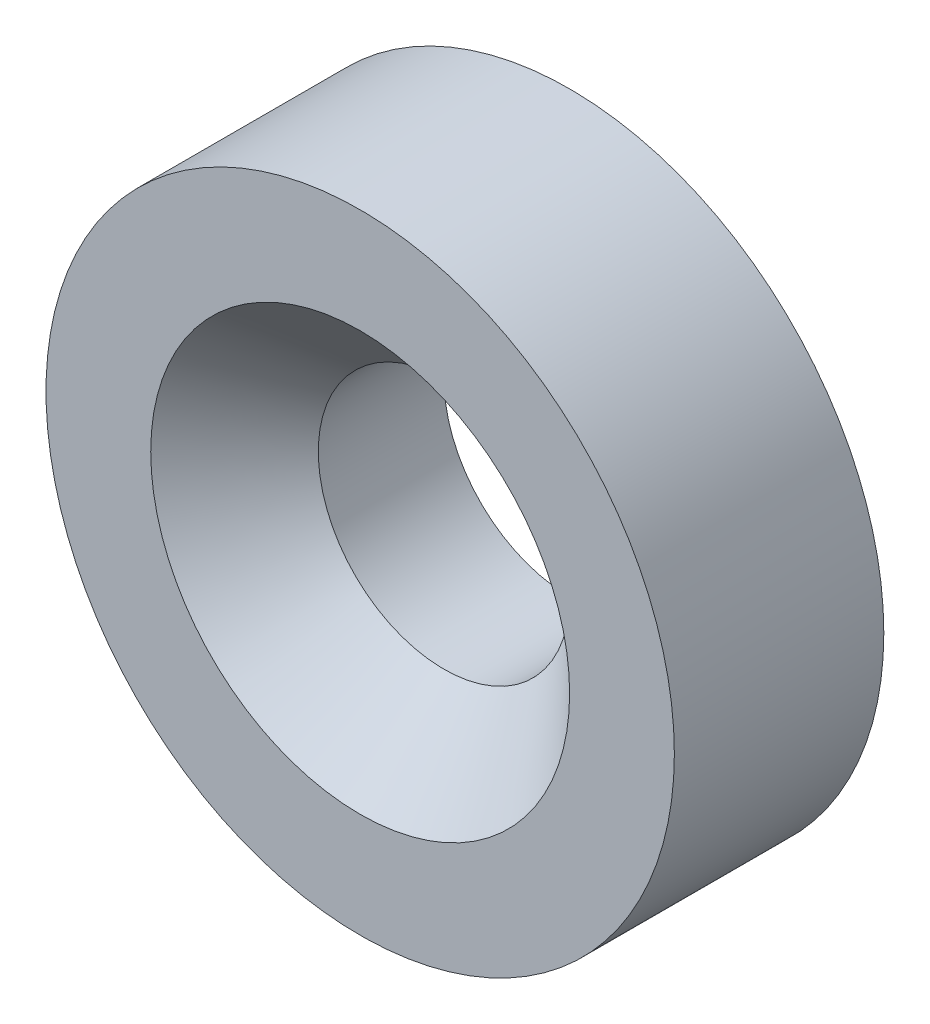
ISO-10303-21;
HEADER;
FILE_DESCRIPTION(('STEP AP214'),'2;1');
FILE_NAME('part.step','',(''),(''),'','','');
FILE_SCHEMA(('AUTOMOTIVE_DESIGN { 1 0 10303 214 1 1 1 1 }'));
ENDSEC;
DATA;
#1=APPLICATION_CONTEXT('core data for automotive mechanical design processes');
#2=APPLICATION_PROTOCOL_DEFINITION('international standard','automotive_design',2000,#1);
#3=PRODUCT_CONTEXT('',#1,'mechanical');
#4=PRODUCT('Part','Part','',(#3));
#5=PRODUCT_RELATED_PRODUCT_CATEGORY('part','',(#4));
#6=PRODUCT_DEFINITION_FORMATION('','',#4);
#7=PRODUCT_DEFINITION_CONTEXT('part definition',#1,'design');
#8=PRODUCT_DEFINITION('design','',#6,#7);
#9=PRODUCT_DEFINITION_SHAPE('','',#8);
#10=(LENGTH_UNIT() NAMED_UNIT(*) SI_UNIT(.MILLI.,.METRE.));
#11=(NAMED_UNIT(*) PLANE_ANGLE_UNIT() SI_UNIT($,.RADIAN.));
#12=(NAMED_UNIT(*) SI_UNIT($,.STERADIAN.) SOLID_ANGLE_UNIT());
#13=UNCERTAINTY_MEASURE_WITH_UNIT(LENGTH_MEASURE(1.E-05),#10,'distance_accuracy_value','');
#14=(GEOMETRIC_REPRESENTATION_CONTEXT(3) GLOBAL_UNCERTAINTY_ASSIGNED_CONTEXT((#13)) GLOBAL_UNIT_ASSIGNED_CONTEXT((#10,
#11,#12)) REPRESENTATION_CONTEXT('',''));
#15=CARTESIAN_POINT('',(0.,0.,0.));
#16=DIRECTION('',(0.,0.,1.));
#17=DIRECTION('',(1.,0.,0.));
#18=AXIS2_PLACEMENT_3D('',#15,#16,#17);
#19=CARTESIAN_POINT('',(0.,0.,0.5));
#20=DIRECTION('',(0.,0.,-1.));
#21=DIRECTION('',(-1.,0.,0.));
#22=AXIS2_PLACEMENT_3D('',#19,#20,#21);
#23=CYLINDRICAL_SURFACE('',#22,0.75);
#24=CARTESIAN_POINT('',(0.,0.,0.5));
#25=DIRECTION('',(0.,0.,1.));
#26=DIRECTION('',(1.,0.,0.));
#27=AXIS2_PLACEMENT_3D('',#24,#25,#26);
#28=CIRCLE('',#27,0.75);
#29=CARTESIAN_POINT('',(0.75,0.,0.5));
#30=VERTEX_POINT('',#29);
#31=EDGE_CURVE('E41',#30,#30,#28,.T.);
#32=ORIENTED_EDGE('',*,*,#31,.F.);
#33=EDGE_LOOP('',(#32));
#34=FACE_BOUND('',#33,.T.);
#35=CARTESIAN_POINT('',(0.,0.,0.));
#36=DIRECTION('',(0.,0.,1.));
#37=DIRECTION('',(1.,0.,0.));
#38=AXIS2_PLACEMENT_3D('',#35,#36,#37);
#39=CIRCLE('',#38,0.75);
#40=CARTESIAN_POINT('',(0.75,0.,0.));
#41=VERTEX_POINT('',#40);
#42=EDGE_CURVE('E45',#41,#41,#39,.T.);
#43=ORIENTED_EDGE('',*,*,#42,.T.);
#44=EDGE_LOOP('',(#43));
#45=FACE_BOUND('',#44,.T.);
#46=ADVANCED_FACE('F30',(#34,#45),#23,.T.);
#47=CARTESIAN_POINT('',(0.,0.,0.5));
#48=DIRECTION('',(0.,0.,1.));
#49=DIRECTION('',(1.,0.,0.));
#50=AXIS2_PLACEMENT_3D('',#47,#48,#49);
#51=PLANE('',#50);
#52=CARTESIAN_POINT('',(0.,0.,0.5));
#53=DIRECTION('',(0.,0.,1.));
#54=DIRECTION('',(1.,0.,0.));
#55=AXIS2_PLACEMENT_3D('',#52,#53,#54);
#56=CIRCLE('',#55,0.500000000000001);
#57=CARTESIAN_POINT('',(0.500000000000001,0.,0.5));
#58=VERTEX_POINT('',#57);
#59=EDGE_CURVE('E10',#58,#58,#56,.F.);
#60=ORIENTED_EDGE('',*,*,#59,.T.);
#61=EDGE_LOOP('',(#60));
#62=FACE_BOUND('',#61,.T.);
#63=ORIENTED_EDGE('',*,*,#31,.T.);
#64=EDGE_LOOP('',(#63));
#65=FACE_BOUND('',#64,.T.);
#66=ADVANCED_FACE('F65',(#62,#65),#51,.T.);
#67=CARTESIAN_POINT('',(0.,0.,0.));
#68=DIRECTION('',(0.,0.,1.));
#69=DIRECTION('',(1.,0.,0.));
#70=AXIS2_PLACEMENT_3D('',#67,#68,#69);
#71=PLANE('',#70);
#72=CARTESIAN_POINT('',(0.,0.,0.));
#73=DIRECTION('',(0.,0.,1.));
#74=DIRECTION('',(1.,0.,0.));
#75=AXIS2_PLACEMENT_3D('',#72,#73,#74);
#76=CIRCLE('',#75,0.3);
#77=CARTESIAN_POINT('',(0.3,0.,0.));
#78=VERTEX_POINT('',#77);
#79=EDGE_CURVE('E49',#78,#78,#76,.T.);
#80=ORIENTED_EDGE('',*,*,#79,.T.);
#81=EDGE_LOOP('',(#80));
#82=FACE_BOUND('',#81,.T.);
#83=ORIENTED_EDGE('',*,*,#42,.F.);
#84=EDGE_LOOP('',(#83));
#85=FACE_BOUND('',#84,.T.);
#86=ADVANCED_FACE('F54',(#82,#85),#71,.F.);
#87=CARTESIAN_POINT('',(0.,0.,0.));
#88=DIRECTION('',(0.,0.,1.));
#89=DIRECTION('',(1.,0.,0.));
#90=AXIS2_PLACEMENT_3D('',#87,#88,#89);
#91=CYLINDRICAL_SURFACE('',#90,0.3);
#92=CARTESIAN_POINT('',(0.,0.,0.3));
#93=DIRECTION('',(0.,0.,1.));
#94=DIRECTION('',(1.,0.,0.));
#95=AXIS2_PLACEMENT_3D('',#92,#93,#94);
#96=CIRCLE('',#95,0.3);
#97=CARTESIAN_POINT('',(0.3,0.,0.3));
#98=VERTEX_POINT('',#97);
#99=EDGE_CURVE('E37',#98,#98,#96,.T.);
#100=ORIENTED_EDGE('',*,*,#99,.T.);
#101=EDGE_LOOP('',(#100));
#102=FACE_BOUND('',#101,.T.);
#103=ORIENTED_EDGE('',*,*,#79,.F.);
#104=EDGE_LOOP('',(#103));
#105=FACE_BOUND('',#104,.T.);
#106=ADVANCED_FACE('F57',(#102,#105),#91,.F.);
#107=CARTESIAN_POINT('',(0.,0.,0.3));
#108=DIRECTION('',(0.,0.,1.));
#109=DIRECTION('',(1.,0.,0.));
#110=AXIS2_PLACEMENT_3D('',#107,#108,#109);
#111=CONICAL_SURFACE('',#110,0.3,0.78539816339745);
#112=ORIENTED_EDGE('',*,*,#59,.F.);
#113=EDGE_LOOP('',(#112));
#114=FACE_BOUND('',#113,.T.);
#115=ORIENTED_EDGE('',*,*,#99,.F.);
#116=EDGE_LOOP('',(#115));
#117=FACE_BOUND('',#116,.T.);
#118=ADVANCED_FACE('F32',(#114,#117),#111,.F.);
#119=CLOSED_SHELL('',(#46,#66,#86,#106,#118));
#120=MANIFOLD_SOLID_BREP('B2',#119);
#121=ADVANCED_BREP_SHAPE_REPRESENTATION('',(#18,#120),#14);
#122=SHAPE_DEFINITION_REPRESENTATION(#9,#121);
ENDSEC;
END-ISO-10303-21;
